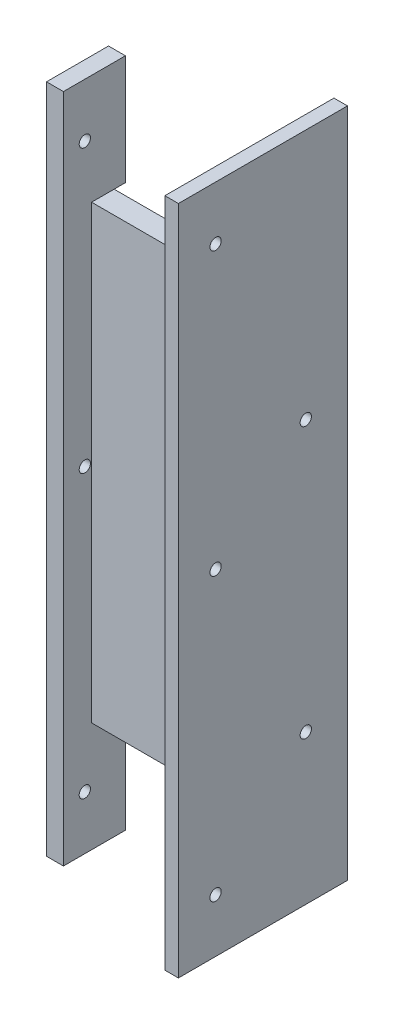
ISO-10303-21;
HEADER;
FILE_DESCRIPTION(('STEP AP214'),'2;1');
FILE_NAME('part.step','',(''),(''),'','','');
FILE_SCHEMA(('AUTOMOTIVE_DESIGN { 1 0 10303 214 1 1 1 1 }'));
ENDSEC;
DATA;
#1=APPLICATION_CONTEXT('core data for automotive mechanical design processes');
#2=APPLICATION_PROTOCOL_DEFINITION('international standard','automotive_design',2000,#1);
#3=PRODUCT_CONTEXT('',#1,'mechanical');
#4=PRODUCT('Part','Part','',(#3));
#5=PRODUCT_RELATED_PRODUCT_CATEGORY('part','',(#4));
#6=PRODUCT_DEFINITION_FORMATION('','',#4);
#7=PRODUCT_DEFINITION_CONTEXT('part definition',#1,'design');
#8=PRODUCT_DEFINITION('design','',#6,#7);
#9=PRODUCT_DEFINITION_SHAPE('','',#8);
#10=(LENGTH_UNIT() NAMED_UNIT(*) SI_UNIT(.MILLI.,.METRE.));
#11=(NAMED_UNIT(*) PLANE_ANGLE_UNIT() SI_UNIT($,.RADIAN.));
#12=(NAMED_UNIT(*) SI_UNIT($,.STERADIAN.) SOLID_ANGLE_UNIT());
#13=UNCERTAINTY_MEASURE_WITH_UNIT(LENGTH_MEASURE(1.E-05),#10,'distance_accuracy_value','');
#14=(GEOMETRIC_REPRESENTATION_CONTEXT(3) GLOBAL_UNCERTAINTY_ASSIGNED_CONTEXT((#13)) GLOBAL_UNIT_ASSIGNED_CONTEXT((#10,
#11,#12)) REPRESENTATION_CONTEXT('',''));
#15=CARTESIAN_POINT('',(0.,0.,0.));
#16=DIRECTION('',(0.,0.,1.));
#17=DIRECTION('',(1.,0.,0.));
#18=AXIS2_PLACEMENT_3D('',#15,#16,#17);
#19=CARTESIAN_POINT('',(1.5,-29.75,-1.50000000000001));
#20=DIRECTION('',(0.,0.,1.));
#21=DIRECTION('',(0.,-1.,0.));
#22=AXIS2_PLACEMENT_3D('',#19,#20,#21);
#23=PLANE('',#22);
#24=DIRECTION('',(0.,-1.,0.));
#25=VECTOR('',#24,1.);
#26=CARTESIAN_POINT('',(15.5,-20.,-1.5));
#27=LINE('',#26,#25);
#28=CARTESIAN_POINT('',(15.5,10.5,-1.5));
#29=VERTEX_POINT('',#28);
#30=CARTESIAN_POINT('',(15.5,-20.,-1.5));
#31=VERTEX_POINT('',#30);
#32=EDGE_CURVE('E288',#29,#31,#27,.T.);
#33=ORIENTED_EDGE('',*,*,#32,.T.);
#34=DIRECTION('',(-1.,0.,0.));
#35=VECTOR('',#34,1.);
#36=CARTESIAN_POINT('',(15.5,-20.,-1.5));
#37=LINE('',#36,#35);
#38=CARTESIAN_POINT('',(3.,-20.,-1.5));
#39=VERTEX_POINT('',#38);
#40=EDGE_CURVE('E307',#31,#39,#37,.T.);
#41=ORIENTED_EDGE('',*,*,#40,.T.);
#42=DIRECTION('',(0.,1.,0.));
#43=VECTOR('',#42,1.);
#44=CARTESIAN_POINT('',(3.,-29.75,-1.50000000000001));
#45=LINE('',#44,#43);
#46=CARTESIAN_POINT('',(3.,-29.75,-1.50000000000001));
#47=VERTEX_POINT('',#46);
#48=EDGE_CURVE('E331',#47,#39,#45,.T.);
#49=ORIENTED_EDGE('',*,*,#48,.F.);
#50=DIRECTION('',(1.,0.,0.));
#51=VECTOR('',#50,1.);
#52=CARTESIAN_POINT('',(1.5,-29.75,-1.50000000000001));
#53=LINE('',#52,#51);
#54=CARTESIAN_POINT('',(1.5,-29.75,-1.50000000000001));
#55=VERTEX_POINT('',#54);
#56=EDGE_CURVE('E330',#55,#47,#53,.T.);
#57=ORIENTED_EDGE('',*,*,#56,.F.);
#58=DIRECTION('',(0.,1.,0.));
#59=VECTOR('',#58,1.);
#60=CARTESIAN_POINT('',(1.5,-29.75,-1.50000000000001));
#61=LINE('',#60,#59);
#62=CARTESIAN_POINT('',(1.5,10.5,-1.5));
#63=VERTEX_POINT('',#62);
#64=EDGE_CURVE('E314',#55,#63,#61,.T.);
#65=ORIENTED_EDGE('',*,*,#64,.T.);
#66=DIRECTION('',(1.,0.,0.));
#67=VECTOR('',#66,1.);
#68=CARTESIAN_POINT('',(15.5,10.5,-1.5));
#69=LINE('',#68,#67);
#70=EDGE_CURVE('E222',#63,#29,#69,.T.);
#71=ORIENTED_EDGE('',*,*,#70,.T.);
#72=EDGE_LOOP('',(#33,#41,#49,#57,#65,#71));
#73=FACE_BOUND('',#72,.T.);
#74=ADVANCED_FACE('F49',(#73),#23,.F.);
#75=CARTESIAN_POINT('',(1.5,20.,-1.5));
#76=VERTEX_POINT('',#75);
#77=CARTESIAN_POINT('',(1.5,29.75,-1.49999999999999));
#78=VERTEX_POINT('',#77);
#79=EDGE_CURVE('E319',#76,#78,#61,.T.);
#80=ORIENTED_EDGE('',*,*,#79,.T.);
#81=DIRECTION('',(1.,0.,0.));
#82=VECTOR('',#81,1.);
#83=CARTESIAN_POINT('',(1.5,29.75,-1.49999999999999));
#84=LINE('',#83,#82);
#85=CARTESIAN_POINT('',(3.,29.75,-1.49999999999999));
#86=VERTEX_POINT('',#85);
#87=EDGE_CURVE('E11',#78,#86,#84,.T.);
#88=ORIENTED_EDGE('',*,*,#87,.T.);
#89=CARTESIAN_POINT('',(3.,20.,-1.5));
#90=VERTEX_POINT('',#89);
#91=EDGE_CURVE('E313',#90,#86,#45,.T.);
#92=ORIENTED_EDGE('',*,*,#91,.F.);
#93=DIRECTION('',(-1.,0.,0.));
#94=VECTOR('',#93,1.);
#95=CARTESIAN_POINT('',(15.5,20.,-1.5));
#96=LINE('',#95,#94);
#97=EDGE_CURVE('E218',#90,#76,#96,.T.);
#98=ORIENTED_EDGE('',*,*,#97,.T.);
#99=EDGE_LOOP('',(#80,#88,#92,#98));
#100=FACE_BOUND('',#99,.T.);
#101=ADVANCED_FACE('F51',(#100),#23,.F.);
#102=CARTESIAN_POINT('',(1.5,29.75,4.00000000000001));
#103=DIRECTION('',(0.,-1.,0.));
#104=DIRECTION('',(0.,0.,-1.));
#105=AXIS2_PLACEMENT_3D('',#102,#103,#104);
#106=PLANE('',#105);
#107=DIRECTION('',(0.,0.,1.));
#108=VECTOR('',#107,1.);
#109=CARTESIAN_POINT('',(3.,29.75,4.00000000000001));
#110=LINE('',#109,#108);
#111=CARTESIAN_POINT('',(3.,29.75,4.00000000000001));
#112=VERTEX_POINT('',#111);
#113=EDGE_CURVE('E335',#86,#112,#110,.T.);
#114=ORIENTED_EDGE('',*,*,#113,.F.);
#115=ORIENTED_EDGE('',*,*,#87,.F.);
#116=DIRECTION('',(0.,0.,1.));
#117=VECTOR('',#116,1.);
#118=CARTESIAN_POINT('',(1.5,29.75,4.00000000000001));
#119=LINE('',#118,#117);
#120=CARTESIAN_POINT('',(1.5,29.75,4.00000000000001));
#121=VERTEX_POINT('',#120);
#122=EDGE_CURVE('E318',#78,#121,#119,.T.);
#123=ORIENTED_EDGE('',*,*,#122,.T.);
#124=DIRECTION('',(1.,0.,0.));
#125=VECTOR('',#124,1.);
#126=CARTESIAN_POINT('',(1.5,29.75,4.00000000000001));
#127=LINE('',#126,#125);
#128=EDGE_CURVE('E59',#121,#112,#127,.T.);
#129=ORIENTED_EDGE('',*,*,#128,.T.);
#130=EDGE_LOOP('',(#114,#115,#123,#129));
#131=FACE_BOUND('',#130,.T.);
#132=ADVANCED_FACE('F656',(#131),#106,.F.);
#133=CARTESIAN_POINT('',(1.5,-29.75,3.99999999999999));
#134=DIRECTION('',(0.,0.,-1.));
#135=DIRECTION('',(0.,1.,0.));
#136=AXIS2_PLACEMENT_3D('',#133,#134,#135);
#137=PLANE('',#136);
#138=DIRECTION('',(0.,-1.,0.));
#139=VECTOR('',#138,1.);
#140=CARTESIAN_POINT('',(3.,-29.75,3.99999999999999));
#141=LINE('',#140,#139);
#142=CARTESIAN_POINT('',(3.,-29.75,3.99999999999999));
#143=VERTEX_POINT('',#142);
#144=EDGE_CURVE('E339',#112,#143,#141,.T.);
#145=ORIENTED_EDGE('',*,*,#144,.F.);
#146=ORIENTED_EDGE('',*,*,#128,.F.);
#147=DIRECTION('',(0.,-1.,0.));
#148=VECTOR('',#147,1.);
#149=CARTESIAN_POINT('',(1.5,-29.75,3.99999999999999));
#150=LINE('',#149,#148);
#151=CARTESIAN_POINT('',(1.5,-29.75,3.99999999999999));
#152=VERTEX_POINT('',#151);
#153=EDGE_CURVE('E323',#121,#152,#150,.T.);
#154=ORIENTED_EDGE('',*,*,#153,.T.);
#155=DIRECTION('',(1.,0.,0.));
#156=VECTOR('',#155,1.);
#157=CARTESIAN_POINT('',(1.5,-29.75,3.99999999999999));
#158=LINE('',#157,#156);
#159=EDGE_CURVE('E349',#152,#143,#158,.T.);
#160=ORIENTED_EDGE('',*,*,#159,.T.);
#161=EDGE_LOOP('',(#145,#146,#154,#160));
#162=FACE_BOUND('',#161,.T.);
#163=ADVANCED_FACE('F654',(#162),#137,.F.);
#164=CARTESIAN_POINT('',(1.5,-29.75,3.99999999999999));
#165=DIRECTION('',(0.,1.,0.));
#166=DIRECTION('',(0.,0.,1.));
#167=AXIS2_PLACEMENT_3D('',#164,#165,#166);
#168=PLANE('',#167);
#169=DIRECTION('',(0.,0.,-1.));
#170=VECTOR('',#169,1.);
#171=CARTESIAN_POINT('',(3.,-29.75,3.99999999999999));
#172=LINE('',#171,#170);
#173=EDGE_CURVE('E343',#143,#47,#172,.T.);
#174=ORIENTED_EDGE('',*,*,#173,.F.);
#175=ORIENTED_EDGE('',*,*,#159,.F.);
#176=DIRECTION('',(0.,0.,-1.));
#177=VECTOR('',#176,1.);
#178=CARTESIAN_POINT('',(1.5,-29.75,3.99999999999999));
#179=LINE('',#178,#177);
#180=EDGE_CURVE('E327',#152,#55,#179,.T.);
#181=ORIENTED_EDGE('',*,*,#180,.T.);
#182=ORIENTED_EDGE('',*,*,#56,.T.);
#183=EDGE_LOOP('',(#174,#175,#181,#182));
#184=FACE_BOUND('',#183,.T.);
#185=ADVANCED_FACE('F651',(#184),#168,.F.);
#186=CARTESIAN_POINT('',(1.5,0.,0.));
#187=DIRECTION('',(1.,0.,0.));
#188=DIRECTION('',(0.,0.,1.));
#189=AXIS2_PLACEMENT_3D('',#186,#187,#188);
#190=PLANE('',#189);
#191=CARTESIAN_POINT('',(1.5,-25.,2.09999999999999));
#192=DIRECTION('',(1.,0.,0.));
#193=DIRECTION('',(0.,0.,-1.));
#194=AXIS2_PLACEMENT_3D('',#191,#192,#193);
#195=CIRCLE('',#194,0.5);
#196=CARTESIAN_POINT('',(1.5,-25.,1.59999999999999));
#197=VERTEX_POINT('',#196);
#198=EDGE_CURVE('E360',#197,#197,#195,.T.);
#199=ORIENTED_EDGE('',*,*,#198,.T.);
#200=EDGE_LOOP('',(#199));
#201=FACE_BOUND('',#200,.T.);
#202=CARTESIAN_POINT('',(1.5,0.,2.10000000000007));
#203=DIRECTION('',(1.,0.,0.));
#204=DIRECTION('',(0.,0.,-1.));
#205=AXIS2_PLACEMENT_3D('',#202,#203,#204);
#206=CIRCLE('',#205,0.5);
#207=CARTESIAN_POINT('',(1.5,0.,1.60000000000007));
#208=VERTEX_POINT('',#207);
#209=EDGE_CURVE('E535',#208,#208,#206,.T.);
#210=ORIENTED_EDGE('',*,*,#209,.T.);
#211=EDGE_LOOP('',(#210));
#212=FACE_BOUND('',#211,.T.);
#213=CARTESIAN_POINT('',(1.5,25.,2.10000000000016));
#214=DIRECTION('',(1.,0.,0.));
#215=DIRECTION('',(0.,0.,-1.));
#216=AXIS2_PLACEMENT_3D('',#213,#214,#215);
#217=CIRCLE('',#216,0.5);
#218=CARTESIAN_POINT('',(1.5,25.,1.60000000000016));
#219=VERTEX_POINT('',#218);
#220=EDGE_CURVE('E555',#219,#219,#217,.T.);
#221=ORIENTED_EDGE('',*,*,#220,.T.);
#222=EDGE_LOOP('',(#221));
#223=FACE_BOUND('',#222,.T.);
#224=ORIENTED_EDGE('',*,*,#64,.F.);
#225=ORIENTED_EDGE('',*,*,#180,.F.);
#226=ORIENTED_EDGE('',*,*,#153,.F.);
#227=ORIENTED_EDGE('',*,*,#122,.F.);
#228=ORIENTED_EDGE('',*,*,#79,.F.);
#229=DIRECTION('',(0.,0.,-1.));
#230=VECTOR('',#229,1.);
#231=CARTESIAN_POINT('',(1.5,20.,-0.499999999999996));
#232=LINE('',#231,#230);
#233=CARTESIAN_POINT('',(1.5,20.,-0.499999999999996));
#234=VERTEX_POINT('',#233);
#235=EDGE_CURVE('E206',#234,#76,#232,.T.);
#236=ORIENTED_EDGE('',*,*,#235,.F.);
#237=DIRECTION('',(0.,-1.,0.));
#238=VECTOR('',#237,1.);
#239=CARTESIAN_POINT('',(1.5,20.,-0.499999999999996));
#240=LINE('',#239,#238);
#241=CARTESIAN_POINT('',(1.5,10.5,-0.499999999999997));
#242=VERTEX_POINT('',#241);
#243=EDGE_CURVE('E207',#234,#242,#240,.T.);
#244=ORIENTED_EDGE('',*,*,#243,.T.);
#245=DIRECTION('',(0.,0.,-1.));
#246=VECTOR('',#245,1.);
#247=CARTESIAN_POINT('',(1.5,10.5,-0.499999999999997));
#248=LINE('',#247,#246);
#249=EDGE_CURVE('E203',#242,#63,#248,.T.);
#250=ORIENTED_EDGE('',*,*,#249,.T.);
#251=EDGE_LOOP('',(#224,#225,#226,#227,#228,#236,#244,#250));
#252=FACE_BOUND('',#251,.T.);
#253=ADVANCED_FACE('F446',(#201,#212,#223,#252),#190,.F.);
#254=CARTESIAN_POINT('',(3.,0.,0.));
#255=DIRECTION('',(1.,0.,0.));
#256=DIRECTION('',(0.,0.,1.));
#257=AXIS2_PLACEMENT_3D('',#254,#255,#256);
#258=PLANE('',#257);
#259=CARTESIAN_POINT('',(3.,-25.,2.09999999999999));
#260=DIRECTION('',(-1.,0.,0.));
#261=DIRECTION('',(0.,0.,1.));
#262=AXIS2_PLACEMENT_3D('',#259,#260,#261);
#263=CIRCLE('',#262,0.5);
#264=CARTESIAN_POINT('',(3.,-25.,2.59999999999999));
#265=VERTEX_POINT('',#264);
#266=EDGE_CURVE('E53',#265,#265,#263,.T.);
#267=ORIENTED_EDGE('',*,*,#266,.T.);
#268=EDGE_LOOP('',(#267));
#269=FACE_BOUND('',#268,.T.);
#270=CARTESIAN_POINT('',(3.,0.,2.10000000000007));
#271=DIRECTION('',(-1.,0.,0.));
#272=DIRECTION('',(0.,0.,1.));
#273=AXIS2_PLACEMENT_3D('',#270,#271,#272);
#274=CIRCLE('',#273,0.5);
#275=CARTESIAN_POINT('',(3.,0.,2.60000000000007));
#276=VERTEX_POINT('',#275);
#277=EDGE_CURVE('E359',#276,#276,#274,.T.);
#278=ORIENTED_EDGE('',*,*,#277,.T.);
#279=EDGE_LOOP('',(#278));
#280=FACE_BOUND('',#279,.T.);
#281=CARTESIAN_POINT('',(3.,25.,2.10000000000016));
#282=DIRECTION('',(-1.,0.,0.));
#283=DIRECTION('',(0.,0.,1.));
#284=AXIS2_PLACEMENT_3D('',#281,#282,#283);
#285=CIRCLE('',#284,0.5);
#286=CARTESIAN_POINT('',(3.,25.,2.60000000000016));
#287=VERTEX_POINT('',#286);
#288=EDGE_CURVE('E356',#287,#287,#285,.T.);
#289=ORIENTED_EDGE('',*,*,#288,.T.);
#290=EDGE_LOOP('',(#289));
#291=FACE_BOUND('',#290,.T.);
#292=DIRECTION('',(0.,0.,1.));
#293=VECTOR('',#292,1.);
#294=CARTESIAN_POINT('',(3.,-20.,-1.5));
#295=LINE('',#294,#293);
#296=CARTESIAN_POINT('',(3.,-20.,1.5));
#297=VERTEX_POINT('',#296);
#298=EDGE_CURVE('E284',#39,#297,#295,.T.);
#299=ORIENTED_EDGE('',*,*,#298,.T.);
#300=DIRECTION('',(0.,1.,0.));
#301=VECTOR('',#300,1.);
#302=CARTESIAN_POINT('',(3.,-20.,1.5));
#303=LINE('',#302,#301);
#304=CARTESIAN_POINT('',(3.,20.,1.5));
#305=VERTEX_POINT('',#304);
#306=EDGE_CURVE('E279',#297,#305,#303,.T.);
#307=ORIENTED_EDGE('',*,*,#306,.T.);
#308=DIRECTION('',(0.,0.,-1.));
#309=VECTOR('',#308,1.);
#310=CARTESIAN_POINT('',(3.,20.,-1.5));
#311=LINE('',#310,#309);
#312=CARTESIAN_POINT('',(3.,20.,-0.499999999999996));
#313=VERTEX_POINT('',#312);
#314=EDGE_CURVE('E298',#305,#313,#311,.T.);
#315=ORIENTED_EDGE('',*,*,#314,.T.);
#316=DIRECTION('',(0.,0.,-1.));
#317=VECTOR('',#316,1.);
#318=CARTESIAN_POINT('',(3.,20.,0.));
#319=LINE('',#318,#317);
#320=EDGE_CURVE('E228',#313,#90,#319,.T.);
#321=ORIENTED_EDGE('',*,*,#320,.T.);
#322=ORIENTED_EDGE('',*,*,#91,.T.);
#323=ORIENTED_EDGE('',*,*,#113,.T.);
#324=ORIENTED_EDGE('',*,*,#144,.T.);
#325=ORIENTED_EDGE('',*,*,#173,.T.);
#326=ORIENTED_EDGE('',*,*,#48,.T.);
#327=EDGE_LOOP('',(#299,#307,#315,#321,#322,#323,#324,#325,#326));
#328=FACE_BOUND('',#327,.T.);
#329=ADVANCED_FACE('F648',(#269,#280,#291,#328),#258,.T.);
#330=CARTESIAN_POINT('',(15.5,-20.,1.5));
#331=DIRECTION('',(0.,0.,-1.));
#332=DIRECTION('',(1.,0.,0.));
#333=AXIS2_PLACEMENT_3D('',#330,#331,#332);
#334=PLANE('',#333);
#335=ORIENTED_EDGE('',*,*,#306,.F.);
#336=DIRECTION('',(-1.,0.,0.));
#337=VECTOR('',#336,1.);
#338=CARTESIAN_POINT('',(15.5,-20.,1.5));
#339=LINE('',#338,#337);
#340=CARTESIAN_POINT('',(15.5,-20.,1.5));
#341=VERTEX_POINT('',#340);
#342=EDGE_CURVE('E67',#341,#297,#339,.T.);
#343=ORIENTED_EDGE('',*,*,#342,.F.);
#344=DIRECTION('',(0.,1.,0.));
#345=VECTOR('',#344,1.);
#346=CARTESIAN_POINT('',(15.5,-20.,1.5));
#347=LINE('',#346,#345);
#348=CARTESIAN_POINT('',(15.5,20.,1.5));
#349=VERTEX_POINT('',#348);
#350=EDGE_CURVE('E280',#341,#349,#347,.T.);
#351=ORIENTED_EDGE('',*,*,#350,.T.);
#352=DIRECTION('',(-1.,0.,0.));
#353=VECTOR('',#352,1.);
#354=CARTESIAN_POINT('',(15.5,20.,1.5));
#355=LINE('',#354,#353);
#356=EDGE_CURVE('E74',#349,#305,#355,.T.);
#357=ORIENTED_EDGE('',*,*,#356,.T.);
#358=EDGE_LOOP('',(#335,#343,#351,#357));
#359=FACE_BOUND('',#358,.T.);
#360=ADVANCED_FACE('F659',(#359),#334,.F.);
#361=CARTESIAN_POINT('',(15.5,20.,-1.5));
#362=DIRECTION('',(0.,-1.,0.));
#363=DIRECTION('',(0.,0.,-1.));
#364=AXIS2_PLACEMENT_3D('',#361,#362,#363);
#365=PLANE('',#364);
#366=ORIENTED_EDGE('',*,*,#314,.F.);
#367=ORIENTED_EDGE('',*,*,#356,.F.);
#368=DIRECTION('',(0.,0.,-1.));
#369=VECTOR('',#368,1.);
#370=CARTESIAN_POINT('',(15.5,20.,-1.5));
#371=LINE('',#370,#369);
#372=CARTESIAN_POINT('',(15.5,20.,-0.499999999999996));
#373=VERTEX_POINT('',#372);
#374=EDGE_CURVE('E283',#349,#373,#371,.T.);
#375=ORIENTED_EDGE('',*,*,#374,.T.);
#376=DIRECTION('',(-1.,0.,0.));
#377=VECTOR('',#376,1.);
#378=CARTESIAN_POINT('',(15.5,20.,-0.499999999999996));
#379=LINE('',#378,#377);
#380=EDGE_CURVE('E214',#373,#313,#379,.T.);
#381=ORIENTED_EDGE('',*,*,#380,.T.);
#382=EDGE_LOOP('',(#366,#367,#375,#381));
#383=FACE_BOUND('',#382,.T.);
#384=ADVANCED_FACE('F658',(#383),#365,.F.);
#385=CARTESIAN_POINT('',(15.5,-20.,-1.5));
#386=DIRECTION('',(0.,1.,0.));
#387=DIRECTION('',(0.,0.,1.));
#388=AXIS2_PLACEMENT_3D('',#385,#386,#387);
#389=PLANE('',#388);
#390=ORIENTED_EDGE('',*,*,#298,.F.);
#391=ORIENTED_EDGE('',*,*,#40,.F.);
#392=DIRECTION('',(0.,0.,1.));
#393=VECTOR('',#392,1.);
#394=CARTESIAN_POINT('',(15.5,-20.,-1.5));
#395=LINE('',#394,#393);
#396=EDGE_CURVE('E292',#31,#341,#395,.T.);
#397=ORIENTED_EDGE('',*,*,#396,.T.);
#398=ORIENTED_EDGE('',*,*,#342,.T.);
#399=EDGE_LOOP('',(#390,#391,#397,#398));
#400=FACE_BOUND('',#399,.T.);
#401=ADVANCED_FACE('F645',(#400),#389,.F.);
#402=CARTESIAN_POINT('',(16.7,-29.75,7.5));
#403=DIRECTION('',(0.,0.,-1.));
#404=DIRECTION('',(1.,0.,0.));
#405=AXIS2_PLACEMENT_3D('',#402,#403,#404);
#406=PLANE('',#405);
#407=DIRECTION('',(0.,1.,0.));
#408=VECTOR('',#407,1.);
#409=CARTESIAN_POINT('',(15.5,-29.75,7.5));
#410=LINE('',#409,#408);
#411=CARTESIAN_POINT('',(15.5,-29.75,7.5));
#412=VERTEX_POINT('',#411);
#413=CARTESIAN_POINT('',(15.5,29.75,7.5));
#414=VERTEX_POINT('',#413);
#415=EDGE_CURVE('E232',#412,#414,#410,.T.);
#416=ORIENTED_EDGE('',*,*,#415,.F.);
#417=DIRECTION('',(-1.,0.,0.));
#418=VECTOR('',#417,1.);
#419=CARTESIAN_POINT('',(16.7,-29.75,7.5));
#420=LINE('',#419,#418);
#421=CARTESIAN_POINT('',(16.7,-29.75,7.5));
#422=VERTEX_POINT('',#421);
#423=EDGE_CURVE('E249',#422,#412,#420,.T.);
#424=ORIENTED_EDGE('',*,*,#423,.F.);
#425=DIRECTION('',(0.,1.,0.));
#426=VECTOR('',#425,1.);
#427=CARTESIAN_POINT('',(16.7,-29.75,7.5));
#428=LINE('',#427,#426);
#429=CARTESIAN_POINT('',(16.7,29.75,7.5));
#430=VERTEX_POINT('',#429);
#431=EDGE_CURVE('E233',#422,#430,#428,.T.);
#432=ORIENTED_EDGE('',*,*,#431,.T.);
#433=DIRECTION('',(-1.,0.,0.));
#434=VECTOR('',#433,1.);
#435=CARTESIAN_POINT('',(16.7,29.75,7.5));
#436=LINE('',#435,#434);
#437=EDGE_CURVE('E275',#430,#414,#436,.T.);
#438=ORIENTED_EDGE('',*,*,#437,.T.);
#439=EDGE_LOOP('',(#416,#424,#432,#438));
#440=FACE_BOUND('',#439,.T.);
#441=ADVANCED_FACE('F631',(#440),#406,.F.);
#442=CARTESIAN_POINT('',(16.7,29.75,-7.5));
#443=DIRECTION('',(0.,-1.,0.));
#444=DIRECTION('',(0.,0.,-1.));
#445=AXIS2_PLACEMENT_3D('',#442,#443,#444);
#446=PLANE('',#445);
#447=DIRECTION('',(0.,0.,-1.));
#448=VECTOR('',#447,1.);
#449=CARTESIAN_POINT('',(15.5,29.75,-7.5));
#450=LINE('',#449,#448);
#451=CARTESIAN_POINT('',(15.5,29.75,-7.5));
#452=VERTEX_POINT('',#451);
#453=EDGE_CURVE('E253',#414,#452,#450,.T.);
#454=ORIENTED_EDGE('',*,*,#453,.F.);
#455=ORIENTED_EDGE('',*,*,#437,.F.);
#456=DIRECTION('',(0.,0.,-1.));
#457=VECTOR('',#456,1.);
#458=CARTESIAN_POINT('',(16.7,29.75,-7.5));
#459=LINE('',#458,#457);
#460=CARTESIAN_POINT('',(16.7,29.75,-7.5));
#461=VERTEX_POINT('',#460);
#462=EDGE_CURVE('E237',#430,#461,#459,.T.);
#463=ORIENTED_EDGE('',*,*,#462,.T.);
#464=DIRECTION('',(-1.,0.,0.));
#465=VECTOR('',#464,1.);
#466=CARTESIAN_POINT('',(16.7,29.75,-7.5));
#467=LINE('',#466,#465);
#468=EDGE_CURVE('E271',#461,#452,#467,.T.);
#469=ORIENTED_EDGE('',*,*,#468,.T.);
#470=EDGE_LOOP('',(#454,#455,#463,#469));
#471=FACE_BOUND('',#470,.T.);
#472=ADVANCED_FACE('F638',(#471),#446,.F.);
#473=CARTESIAN_POINT('',(16.7,-29.75,-7.5));
#474=DIRECTION('',(0.,0.,1.));
#475=DIRECTION('',(-1.,0.,0.));
#476=AXIS2_PLACEMENT_3D('',#473,#474,#475);
#477=PLANE('',#476);
#478=DIRECTION('',(0.,-1.,0.));
#479=VECTOR('',#478,1.);
#480=CARTESIAN_POINT('',(15.5,-29.75,-7.5));
#481=LINE('',#480,#479);
#482=CARTESIAN_POINT('',(15.5,20.,-7.5));
#483=VERTEX_POINT('',#482);
#484=EDGE_CURVE('E258',#452,#483,#481,.T.);
#485=ORIENTED_EDGE('',*,*,#484,.F.);
#486=ORIENTED_EDGE('',*,*,#468,.F.);
#487=DIRECTION('',(0.,-1.,0.));
#488=VECTOR('',#487,1.);
#489=CARTESIAN_POINT('',(16.7,-29.75,-7.5));
#490=LINE('',#489,#488);
#491=CARTESIAN_POINT('',(16.7,-29.75,-7.5));
#492=VERTEX_POINT('',#491);
#493=EDGE_CURVE('E242',#461,#492,#490,.T.);
#494=ORIENTED_EDGE('',*,*,#493,.T.);
#495=DIRECTION('',(-1.,0.,0.));
#496=VECTOR('',#495,1.);
#497=CARTESIAN_POINT('',(16.7,-29.75,-7.5));
#498=LINE('',#497,#496);
#499=CARTESIAN_POINT('',(15.5,-29.75,-7.5));
#500=VERTEX_POINT('',#499);
#501=EDGE_CURVE('E267',#492,#500,#498,.T.);
#502=ORIENTED_EDGE('',*,*,#501,.T.);
#503=CARTESIAN_POINT('',(15.5,10.5,-7.5));
#504=VERTEX_POINT('',#503);
#505=EDGE_CURVE('E257',#504,#500,#481,.T.);
#506=ORIENTED_EDGE('',*,*,#505,.F.);
#507=DIRECTION('',(-1.,0.,0.));
#508=VECTOR('',#507,1.);
#509=CARTESIAN_POINT('',(15.7,10.5,-7.5));
#510=LINE('',#509,#508);
#511=CARTESIAN_POINT('',(15.7,10.5,-7.5));
#512=VERTEX_POINT('',#511);
#513=EDGE_CURVE('E415',#512,#504,#510,.T.);
#514=ORIENTED_EDGE('',*,*,#513,.F.);
#515=DIRECTION('',(0.,1.,0.));
#516=VECTOR('',#515,1.);
#517=CARTESIAN_POINT('',(15.7,10.5,-7.5));
#518=LINE('',#517,#516);
#519=CARTESIAN_POINT('',(15.7,20.,-7.5));
#520=VERTEX_POINT('',#519);
#521=EDGE_CURVE('E195',#512,#520,#518,.T.);
#522=ORIENTED_EDGE('',*,*,#521,.T.);
#523=DIRECTION('',(-1.,0.,0.));
#524=VECTOR('',#523,1.);
#525=CARTESIAN_POINT('',(15.7,20.,-7.5));
#526=LINE('',#525,#524);
#527=EDGE_CURVE('E423',#520,#483,#526,.T.);
#528=ORIENTED_EDGE('',*,*,#527,.T.);
#529=EDGE_LOOP('',(#485,#486,#494,#502,#506,#514,#522,#528));
#530=FACE_BOUND('',#529,.T.);
#531=ADVANCED_FACE('F636',(#530),#477,.F.);
#532=CARTESIAN_POINT('',(16.7,-29.75,-7.5));
#533=DIRECTION('',(0.,1.,0.));
#534=DIRECTION('',(0.,0.,1.));
#535=AXIS2_PLACEMENT_3D('',#532,#533,#534);
#536=PLANE('',#535);
#537=DIRECTION('',(0.,0.,1.));
#538=VECTOR('',#537,1.);
#539=CARTESIAN_POINT('',(15.5,-29.75,-7.5));
#540=LINE('',#539,#538);
#541=EDGE_CURVE('E238',#500,#412,#540,.T.);
#542=ORIENTED_EDGE('',*,*,#541,.F.);
#543=ORIENTED_EDGE('',*,*,#501,.F.);
#544=DIRECTION('',(0.,0.,1.));
#545=VECTOR('',#544,1.);
#546=CARTESIAN_POINT('',(16.7,-29.75,-7.5));
#547=LINE('',#546,#545);
#548=EDGE_CURVE('E246',#492,#422,#547,.T.);
#549=ORIENTED_EDGE('',*,*,#548,.T.);
#550=ORIENTED_EDGE('',*,*,#423,.T.);
#551=EDGE_LOOP('',(#542,#543,#549,#550));
#552=FACE_BOUND('',#551,.T.);
#553=ADVANCED_FACE('F618',(#552),#536,.F.);
#554=CARTESIAN_POINT('',(16.7,0.,0.));
#555=DIRECTION('',(-1.,0.,0.));
#556=DIRECTION('',(0.,0.,-1.));
#557=AXIS2_PLACEMENT_3D('',#554,#555,#556);
#558=PLANE('',#557);
#559=CARTESIAN_POINT('',(16.7,-25.,4.2));
#560=DIRECTION('',(1.,0.,0.));
#561=DIRECTION('',(0.,0.,-1.));
#562=AXIS2_PLACEMENT_3D('',#559,#560,#561);
#563=CIRCLE('',#562,0.500000000000001);
#564=CARTESIAN_POINT('',(16.7,-25.,3.7));
#565=VERTEX_POINT('',#564);
#566=EDGE_CURVE('E405',#565,#565,#563,.T.);
#567=ORIENTED_EDGE('',*,*,#566,.F.);
#568=EDGE_LOOP('',(#567));
#569=FACE_BOUND('',#568,.T.);
#570=CARTESIAN_POINT('',(16.7,-16.5,-3.8));
#571=DIRECTION('',(1.,0.,0.));
#572=DIRECTION('',(0.,0.,-1.));
#573=AXIS2_PLACEMENT_3D('',#570,#571,#572);
#574=CIRCLE('',#573,0.500000000000001);
#575=CARTESIAN_POINT('',(16.7,-16.5,-4.3));
#576=VERTEX_POINT('',#575);
#577=EDGE_CURVE('E401',#576,#576,#574,.T.);
#578=ORIENTED_EDGE('',*,*,#577,.F.);
#579=EDGE_LOOP('',(#578));
#580=FACE_BOUND('',#579,.T.);
#581=CARTESIAN_POINT('',(16.7,0.,4.20000000000009));
#582=DIRECTION('',(1.,0.,0.));
#583=DIRECTION('',(0.,0.,-1.));
#584=AXIS2_PLACEMENT_3D('',#581,#582,#583);
#585=CIRCLE('',#584,0.500000000000001);
#586=CARTESIAN_POINT('',(16.7,0.,3.70000000000008));
#587=VERTEX_POINT('',#586);
#588=EDGE_CURVE('E397',#587,#587,#585,.T.);
#589=ORIENTED_EDGE('',*,*,#588,.F.);
#590=EDGE_LOOP('',(#589));
#591=FACE_BOUND('',#590,.T.);
#592=CARTESIAN_POINT('',(16.7,25.,4.20000000000017));
#593=DIRECTION('',(1.,0.,0.));
#594=DIRECTION('',(0.,0.,-1.));
#595=AXIS2_PLACEMENT_3D('',#592,#593,#594);
#596=CIRCLE('',#595,0.500000000000001);
#597=CARTESIAN_POINT('',(16.7,25.,3.70000000000017));
#598=VERTEX_POINT('',#597);
#599=EDGE_CURVE('E392',#598,#598,#596,.T.);
#600=ORIENTED_EDGE('',*,*,#599,.F.);
#601=EDGE_LOOP('',(#600));
#602=FACE_BOUND('',#601,.T.);
#603=CARTESIAN_POINT('',(16.7,7.5,-3.79999999999992));
#604=DIRECTION('',(1.,0.,0.));
#605=DIRECTION('',(0.,0.,-1.));
#606=AXIS2_PLACEMENT_3D('',#603,#604,#605);
#607=CIRCLE('',#606,0.500000000000001);
#608=CARTESIAN_POINT('',(16.7,7.5,-4.29999999999992));
#609=VERTEX_POINT('',#608);
#610=EDGE_CURVE('E388',#609,#609,#607,.T.);
#611=ORIENTED_EDGE('',*,*,#610,.F.);
#612=EDGE_LOOP('',(#611));
#613=FACE_BOUND('',#612,.T.);
#614=ORIENTED_EDGE('',*,*,#431,.F.);
#615=ORIENTED_EDGE('',*,*,#548,.F.);
#616=ORIENTED_EDGE('',*,*,#493,.F.);
#617=ORIENTED_EDGE('',*,*,#462,.F.);
#618=EDGE_LOOP('',(#614,#615,#616,#617));
#619=FACE_BOUND('',#618,.T.);
#620=ADVANCED_FACE('F615',(#569,#580,#591,#602,#613,#619),#558,.F.);
#621=CARTESIAN_POINT('',(15.5,0.,0.));
#622=DIRECTION('',(-1.,0.,0.));
#623=DIRECTION('',(0.,0.,-1.));
#624=AXIS2_PLACEMENT_3D('',#621,#622,#623);
#625=PLANE('',#624);
#626=CARTESIAN_POINT('',(15.5,-25.,4.2));
#627=DIRECTION('',(1.,0.,0.));
#628=DIRECTION('',(0.,0.,-1.));
#629=AXIS2_PLACEMENT_3D('',#626,#627,#628);
#630=CIRCLE('',#629,0.500000000000001);
#631=CARTESIAN_POINT('',(15.5,-25.,3.7));
#632=VERTEX_POINT('',#631);
#633=EDGE_CURVE('E393',#632,#632,#630,.T.);
#634=ORIENTED_EDGE('',*,*,#633,.T.);
#635=EDGE_LOOP('',(#634));
#636=FACE_BOUND('',#635,.T.);
#637=CARTESIAN_POINT('',(15.5,-16.5,-3.8));
#638=DIRECTION('',(1.,0.,0.));
#639=DIRECTION('',(0.,0.,-1.));
#640=AXIS2_PLACEMENT_3D('',#637,#638,#639);
#641=CIRCLE('',#640,0.500000000000001);
#642=CARTESIAN_POINT('',(15.5,-16.5,-4.3));
#643=VERTEX_POINT('',#642);
#644=EDGE_CURVE('E488',#643,#643,#641,.T.);
#645=ORIENTED_EDGE('',*,*,#644,.T.);
#646=EDGE_LOOP('',(#645));
#647=FACE_BOUND('',#646,.T.);
#648=CARTESIAN_POINT('',(15.5,0.,4.20000000000009));
#649=DIRECTION('',(1.,0.,0.));
#650=DIRECTION('',(0.,0.,-1.));
#651=AXIS2_PLACEMENT_3D('',#648,#649,#650);
#652=CIRCLE('',#651,0.500000000000001);
#653=CARTESIAN_POINT('',(15.5,0.,3.70000000000008));
#654=VERTEX_POINT('',#653);
#655=EDGE_CURVE('E384',#654,#654,#652,.T.);
#656=ORIENTED_EDGE('',*,*,#655,.T.);
#657=EDGE_LOOP('',(#656));
#658=FACE_BOUND('',#657,.T.);
#659=CARTESIAN_POINT('',(15.5,25.,4.20000000000017));
#660=DIRECTION('',(1.,0.,0.));
#661=DIRECTION('',(0.,0.,-1.));
#662=AXIS2_PLACEMENT_3D('',#659,#660,#661);
#663=CIRCLE('',#662,0.500000000000001);
#664=CARTESIAN_POINT('',(15.5,25.,3.70000000000017));
#665=VERTEX_POINT('',#664);
#666=EDGE_CURVE('E376',#665,#665,#663,.T.);
#667=ORIENTED_EDGE('',*,*,#666,.T.);
#668=EDGE_LOOP('',(#667));
#669=FACE_BOUND('',#668,.T.);
#670=CARTESIAN_POINT('',(15.5,7.5,-3.79999999999992));
#671=DIRECTION('',(1.,0.,0.));
#672=DIRECTION('',(0.,0.,-1.));
#673=AXIS2_PLACEMENT_3D('',#670,#671,#672);
#674=CIRCLE('',#673,0.500000000000001);
#675=CARTESIAN_POINT('',(15.5,7.5,-4.29999999999992));
#676=VERTEX_POINT('',#675);
#677=EDGE_CURVE('E369',#676,#676,#674,.T.);
#678=ORIENTED_EDGE('',*,*,#677,.T.);
#679=EDGE_LOOP('',(#678));
#680=FACE_BOUND('',#679,.T.);
#681=DIRECTION('',(0.,0.,1.));
#682=VECTOR('',#681,1.);
#683=CARTESIAN_POINT('',(15.5,20.,-0.499999999999997));
#684=LINE('',#683,#682);
#685=EDGE_CURVE('E190',#483,#373,#684,.T.);
#686=ORIENTED_EDGE('',*,*,#685,.T.);
#687=ORIENTED_EDGE('',*,*,#374,.F.);
#688=ORIENTED_EDGE('',*,*,#350,.F.);
#689=ORIENTED_EDGE('',*,*,#396,.F.);
#690=ORIENTED_EDGE('',*,*,#32,.F.);
#691=DIRECTION('',(0.,0.,-1.));
#692=VECTOR('',#691,1.);
#693=CARTESIAN_POINT('',(15.5,10.5,-0.499999999999997));
#694=LINE('',#693,#692);
#695=EDGE_CURVE('E408',#29,#504,#694,.T.);
#696=ORIENTED_EDGE('',*,*,#695,.T.);
#697=ORIENTED_EDGE('',*,*,#505,.T.);
#698=ORIENTED_EDGE('',*,*,#541,.T.);
#699=ORIENTED_EDGE('',*,*,#415,.T.);
#700=ORIENTED_EDGE('',*,*,#453,.T.);
#701=ORIENTED_EDGE('',*,*,#484,.T.);
#702=EDGE_LOOP('',(#686,#687,#688,#689,#690,#696,#697,#698,#699,#700,#701));
#703=FACE_BOUND('',#702,.T.);
#704=ADVANCED_FACE('F604',(#636,#647,#658,#669,#680,#703),#625,.T.);
#705=CARTESIAN_POINT('',(15.5,10.5,-0.499999999999997));
#706=DIRECTION('',(0.,-1.,0.));
#707=DIRECTION('',(0.,0.,-1.));
#708=AXIS2_PLACEMENT_3D('',#705,#706,#707);
#709=PLANE('',#708);
#710=ORIENTED_EDGE('',*,*,#70,.F.);
#711=ORIENTED_EDGE('',*,*,#249,.F.);
#712=DIRECTION('',(1.,0.,0.));
#713=VECTOR('',#712,1.);
#714=CARTESIAN_POINT('',(15.5,10.5,-0.499999999999997));
#715=LINE('',#714,#713);
#716=CARTESIAN_POINT('',(15.7,10.5,-0.499999999999997));
#717=VERTEX_POINT('',#716);
#718=EDGE_CURVE('E183',#242,#717,#715,.T.);
#719=ORIENTED_EDGE('',*,*,#718,.T.);
#720=DIRECTION('',(0.,0.,-1.));
#721=VECTOR('',#720,1.);
#722=CARTESIAN_POINT('',(15.7,10.5,-0.499999999999997));
#723=LINE('',#722,#721);
#724=EDGE_CURVE('E189',#717,#512,#723,.T.);
#725=ORIENTED_EDGE('',*,*,#724,.T.);
#726=ORIENTED_EDGE('',*,*,#513,.T.);
#727=ORIENTED_EDGE('',*,*,#695,.F.);
#728=EDGE_LOOP('',(#710,#711,#719,#725,#726,#727));
#729=FACE_BOUND('',#728,.T.);
#730=ADVANCED_FACE('F202',(#729),#709,.F.);
#731=CARTESIAN_POINT('',(15.5,20.,-0.499999999999996));
#732=DIRECTION('',(0.,1.,0.));
#733=DIRECTION('',(0.,0.,1.));
#734=AXIS2_PLACEMENT_3D('',#731,#732,#733);
#735=PLANE('',#734);
#736=ORIENTED_EDGE('',*,*,#320,.F.);
#737=EDGE_CURVE('E226',#313,#234,#379,.T.);
#738=ORIENTED_EDGE('',*,*,#737,.T.);
#739=ORIENTED_EDGE('',*,*,#235,.T.);
#740=ORIENTED_EDGE('',*,*,#97,.F.);
#741=EDGE_LOOP('',(#736,#738,#739,#740));
#742=FACE_BOUND('',#741,.T.);
#743=ADVANCED_FACE('F440',(#742),#735,.F.);
#744=CARTESIAN_POINT('',(3.,0.,-0.499999999999999));
#745=DIRECTION('',(0.,0.,1.));
#746=DIRECTION('',(0.,-1.,0.));
#747=AXIS2_PLACEMENT_3D('',#744,#745,#746);
#748=PLANE('',#747);
#749=ORIENTED_EDGE('',*,*,#718,.F.);
#750=ORIENTED_EDGE('',*,*,#243,.F.);
#751=ORIENTED_EDGE('',*,*,#737,.F.);
#752=ORIENTED_EDGE('',*,*,#380,.F.);
#753=DIRECTION('',(-1.,0.,0.));
#754=VECTOR('',#753,1.);
#755=CARTESIAN_POINT('',(15.7,20.,-0.499999999999997));
#756=LINE('',#755,#754);
#757=CARTESIAN_POINT('',(15.7,20.,-0.499999999999997));
#758=VERTEX_POINT('',#757);
#759=EDGE_CURVE('E186',#758,#373,#756,.T.);
#760=ORIENTED_EDGE('',*,*,#759,.F.);
#761=DIRECTION('',(0.,-1.,0.));
#762=VECTOR('',#761,1.);
#763=CARTESIAN_POINT('',(15.7,10.5,-0.499999999999997));
#764=LINE('',#763,#762);
#765=EDGE_CURVE('E178',#758,#717,#764,.T.);
#766=ORIENTED_EDGE('',*,*,#765,.T.);
#767=EDGE_LOOP('',(#749,#750,#751,#752,#760,#766));
#768=FACE_BOUND('',#767,.T.);
#769=ADVANCED_FACE('F180',(#768),#748,.F.);
#770=CARTESIAN_POINT('',(15.7,20.,-0.499999999999997));
#771=DIRECTION('',(0.,1.,0.));
#772=DIRECTION('',(0.,0.,1.));
#773=AXIS2_PLACEMENT_3D('',#770,#771,#772);
#774=PLANE('',#773);
#775=ORIENTED_EDGE('',*,*,#685,.F.);
#776=ORIENTED_EDGE('',*,*,#527,.F.);
#777=DIRECTION('',(0.,0.,1.));
#778=VECTOR('',#777,1.);
#779=CARTESIAN_POINT('',(15.7,20.,-0.499999999999997));
#780=LINE('',#779,#778);
#781=EDGE_CURVE('E412',#520,#758,#780,.T.);
#782=ORIENTED_EDGE('',*,*,#781,.T.);
#783=ORIENTED_EDGE('',*,*,#759,.T.);
#784=EDGE_LOOP('',(#775,#776,#782,#783));
#785=FACE_BOUND('',#784,.T.);
#786=ADVANCED_FACE('F720',(#785),#774,.F.);
#787=CARTESIAN_POINT('',(15.7,0.,0.));
#788=DIRECTION('',(1.,0.,0.));
#789=DIRECTION('',(0.,0.,1.));
#790=AXIS2_PLACEMENT_3D('',#787,#788,#789);
#791=PLANE('',#790);
#792=ORIENTED_EDGE('',*,*,#765,.F.);
#793=ORIENTED_EDGE('',*,*,#781,.F.);
#794=ORIENTED_EDGE('',*,*,#521,.F.);
#795=ORIENTED_EDGE('',*,*,#724,.F.);
#796=EDGE_LOOP('',(#792,#793,#794,#795));
#797=FACE_BOUND('',#796,.T.);
#798=ADVANCED_FACE('F193',(#797),#791,.F.);
#799=CARTESIAN_POINT('',(17.7,7.5,-3.79999999999992));
#800=DIRECTION('',(-1.,0.,0.));
#801=DIRECTION('',(0.,0.,-1.));
#802=AXIS2_PLACEMENT_3D('',#799,#800,#801);
#803=CYLINDRICAL_SURFACE('',#802,0.500000000000001);
#804=ORIENTED_EDGE('',*,*,#677,.F.);
#805=EDGE_LOOP('',(#804));
#806=FACE_BOUND('',#805,.T.);
#807=ORIENTED_EDGE('',*,*,#610,.T.);
#808=EDGE_LOOP('',(#807));
#809=FACE_BOUND('',#808,.T.);
#810=ADVANCED_FACE('F713',(#806,#809),#803,.F.);
#811=CARTESIAN_POINT('',(17.7,25.,4.20000000000017));
#812=DIRECTION('',(-1.,0.,0.));
#813=DIRECTION('',(0.,0.,-1.));
#814=AXIS2_PLACEMENT_3D('',#811,#812,#813);
#815=CYLINDRICAL_SURFACE('',#814,0.500000000000001);
#816=ORIENTED_EDGE('',*,*,#666,.F.);
#817=EDGE_LOOP('',(#816));
#818=FACE_BOUND('',#817,.T.);
#819=ORIENTED_EDGE('',*,*,#599,.T.);
#820=EDGE_LOOP('',(#819));
#821=FACE_BOUND('',#820,.T.);
#822=ADVANCED_FACE('F611',(#818,#821),#815,.F.);
#823=CARTESIAN_POINT('',(17.7,0.,4.20000000000009));
#824=DIRECTION('',(-1.,0.,0.));
#825=DIRECTION('',(0.,0.,-1.));
#826=AXIS2_PLACEMENT_3D('',#823,#824,#825);
#827=CYLINDRICAL_SURFACE('',#826,0.500000000000001);
#828=ORIENTED_EDGE('',*,*,#655,.F.);
#829=EDGE_LOOP('',(#828));
#830=FACE_BOUND('',#829,.T.);
#831=ORIENTED_EDGE('',*,*,#588,.T.);
#832=EDGE_LOOP('',(#831));
#833=FACE_BOUND('',#832,.T.);
#834=ADVANCED_FACE('F607',(#830,#833),#827,.F.);
#835=CARTESIAN_POINT('',(17.7,-16.5,-3.8));
#836=DIRECTION('',(-1.,0.,0.));
#837=DIRECTION('',(0.,0.,-1.));
#838=AXIS2_PLACEMENT_3D('',#835,#836,#837);
#839=CYLINDRICAL_SURFACE('',#838,0.500000000000001);
#840=ORIENTED_EDGE('',*,*,#644,.F.);
#841=EDGE_LOOP('',(#840));
#842=FACE_BOUND('',#841,.T.);
#843=ORIENTED_EDGE('',*,*,#577,.T.);
#844=EDGE_LOOP('',(#843));
#845=FACE_BOUND('',#844,.T.);
#846=ADVANCED_FACE('F610',(#842,#845),#839,.F.);
#847=CARTESIAN_POINT('',(17.7,-25.,4.2));
#848=DIRECTION('',(-1.,0.,0.));
#849=DIRECTION('',(0.,0.,-1.));
#850=AXIS2_PLACEMENT_3D('',#847,#848,#849);
#851=CYLINDRICAL_SURFACE('',#850,0.500000000000001);
#852=ORIENTED_EDGE('',*,*,#633,.F.);
#853=EDGE_LOOP('',(#852));
#854=FACE_BOUND('',#853,.T.);
#855=ORIENTED_EDGE('',*,*,#566,.T.);
#856=EDGE_LOOP('',(#855));
#857=FACE_BOUND('',#856,.T.);
#858=ADVANCED_FACE('F693',(#854,#857),#851,.F.);
#859=CARTESIAN_POINT('',(5.5,25.,2.10000000000016));
#860=DIRECTION('',(-1.,0.,0.));
#861=DIRECTION('',(0.,0.,-1.));
#862=AXIS2_PLACEMENT_3D('',#859,#860,#861);
#863=CYLINDRICAL_SURFACE('',#862,0.5);
#864=ORIENTED_EDGE('',*,*,#288,.F.);
#865=EDGE_LOOP('',(#864));
#866=FACE_BOUND('',#865,.T.);
#867=ORIENTED_EDGE('',*,*,#220,.F.);
#868=EDGE_LOOP('',(#867));
#869=FACE_BOUND('',#868,.T.);
#870=ADVANCED_FACE('F690',(#866,#869),#863,.F.);
#871=CARTESIAN_POINT('',(5.5,0.,2.10000000000007));
#872=DIRECTION('',(-1.,0.,0.));
#873=DIRECTION('',(0.,0.,-1.));
#874=AXIS2_PLACEMENT_3D('',#871,#872,#873);
#875=CYLINDRICAL_SURFACE('',#874,0.5);
#876=ORIENTED_EDGE('',*,*,#277,.F.);
#877=EDGE_LOOP('',(#876));
#878=FACE_BOUND('',#877,.T.);
#879=ORIENTED_EDGE('',*,*,#209,.F.);
#880=EDGE_LOOP('',(#879));
#881=FACE_BOUND('',#880,.T.);
#882=ADVANCED_FACE('F692',(#878,#881),#875,.F.);
#883=CARTESIAN_POINT('',(5.5,-25.,2.09999999999999));
#884=DIRECTION('',(-1.,0.,0.));
#885=DIRECTION('',(0.,0.,-1.));
#886=AXIS2_PLACEMENT_3D('',#883,#884,#885);
#887=CYLINDRICAL_SURFACE('',#886,0.5);
#888=ORIENTED_EDGE('',*,*,#266,.F.);
#889=EDGE_LOOP('',(#888));
#890=FACE_BOUND('',#889,.T.);
#891=ORIENTED_EDGE('',*,*,#198,.F.);
#892=EDGE_LOOP('',(#891));
#893=FACE_BOUND('',#892,.T.);
#894=ADVANCED_FACE('F700',(#890,#893),#887,.F.);
#895=CLOSED_SHELL('',(#74,#101,#132,#163,#185,#253,#329,#360,#384,#401,#441,#472,#531,#553,#620,
#704,#730,#743,#769,#786,#798,#810,#822,#834,#846,#858,#870,#882,#894));
#896=MANIFOLD_SOLID_BREP('B2',#895);
#897=ADVANCED_BREP_SHAPE_REPRESENTATION('',(#18,#896),#14);
#898=SHAPE_DEFINITION_REPRESENTATION(#9,#897);
ENDSEC;
END-ISO-10303-21;
